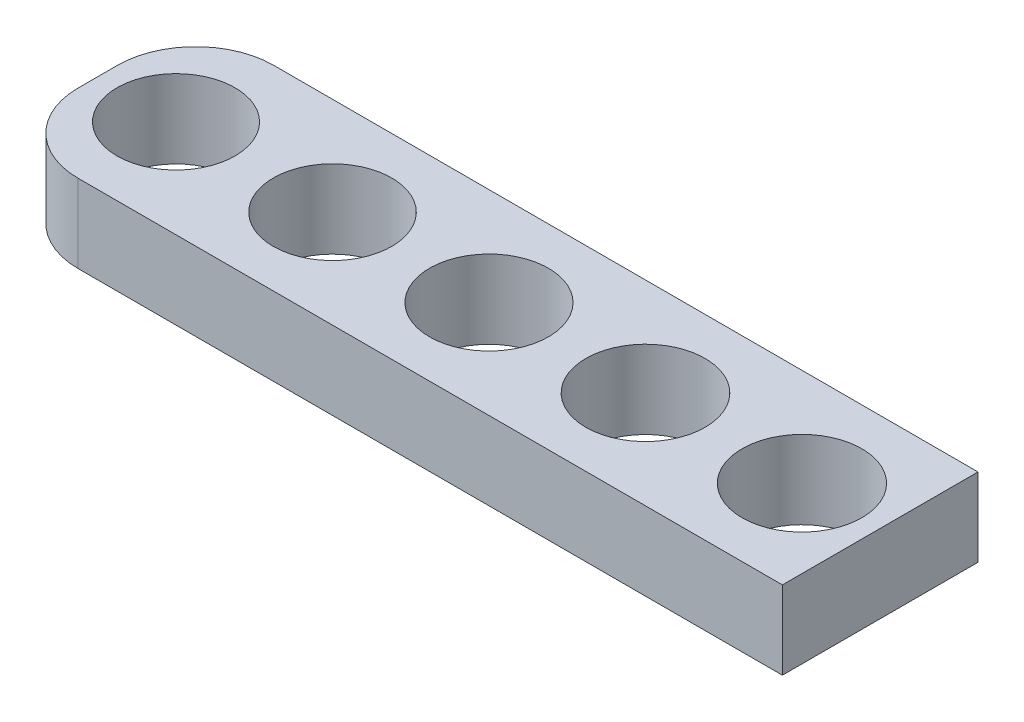
ISO-10303-21;
HEADER;
FILE_DESCRIPTION(('STEP AP214'),'2;1');
FILE_NAME('part.step','',(''),(''),'','','');
FILE_SCHEMA(('AUTOMOTIVE_DESIGN { 1 0 10303 214 1 1 1 1 }'));
ENDSEC;
DATA;
#1=APPLICATION_CONTEXT('core data for automotive mechanical design processes');
#2=APPLICATION_PROTOCOL_DEFINITION('international standard','automotive_design',2000,#1);
#3=PRODUCT_CONTEXT('',#1,'mechanical');
#4=PRODUCT('Part','Part','',(#3));
#5=PRODUCT_RELATED_PRODUCT_CATEGORY('part','',(#4));
#6=PRODUCT_DEFINITION_FORMATION('','',#4);
#7=PRODUCT_DEFINITION_CONTEXT('part definition',#1,'design');
#8=PRODUCT_DEFINITION('design','',#6,#7);
#9=PRODUCT_DEFINITION_SHAPE('','',#8);
#10=(LENGTH_UNIT() NAMED_UNIT(*) SI_UNIT(.MILLI.,.METRE.));
#11=(NAMED_UNIT(*) PLANE_ANGLE_UNIT() SI_UNIT($,.RADIAN.));
#12=(NAMED_UNIT(*) SI_UNIT($,.STERADIAN.) SOLID_ANGLE_UNIT());
#13=UNCERTAINTY_MEASURE_WITH_UNIT(LENGTH_MEASURE(1.E-05),#10,'distance_accuracy_value','');
#14=(GEOMETRIC_REPRESENTATION_CONTEXT(3) GLOBAL_UNCERTAINTY_ASSIGNED_CONTEXT((#13)) GLOBAL_UNIT_ASSIGNED_CONTEXT((#10,
#11,#12)) REPRESENTATION_CONTEXT('',''));
#15=CARTESIAN_POINT('',(0.,0.,0.));
#16=DIRECTION('',(0.,0.,1.));
#17=DIRECTION('',(1.,0.,0.));
#18=AXIS2_PLACEMENT_3D('',#15,#16,#17);
#19=CARTESIAN_POINT('',(-40.,10.,2.5));
#20=DIRECTION('',(0.,1.,0.));
#21=DIRECTION('',(0.,0.,1.));
#22=AXIS2_PLACEMENT_3D('',#19,#20,#21);
#23=PLANE('',#22);
#24=CARTESIAN_POINT('',(20.,10.,0.));
#25=DIRECTION('',(0.,1.,0.));
#26=DIRECTION('',(0.,0.,1.));
#27=AXIS2_PLACEMENT_3D('',#24,#25,#26);
#28=CIRCLE('',#27,7.625);
#29=CARTESIAN_POINT('',(20.,10.,7.625));
#30=VERTEX_POINT('',#29);
#31=EDGE_CURVE('E216',#30,#30,#28,.T.);
#32=ORIENTED_EDGE('',*,*,#31,.F.);
#33=EDGE_LOOP('',(#32));
#34=FACE_BOUND('',#33,.T.);
#35=CARTESIAN_POINT('',(-20.,10.,0.));
#36=DIRECTION('',(0.,1.,0.));
#37=DIRECTION('',(0.,0.,1.));
#38=AXIS2_PLACEMENT_3D('',#35,#36,#37);
#39=CIRCLE('',#38,7.575);
#40=CARTESIAN_POINT('',(-20.,10.,7.575));
#41=VERTEX_POINT('',#40);
#42=EDGE_CURVE('E232',#41,#41,#39,.T.);
#43=ORIENTED_EDGE('',*,*,#42,.F.);
#44=EDGE_LOOP('',(#43));
#45=FACE_BOUND('',#44,.T.);
#46=DIRECTION('',(0.,0.,-1.));
#47=VECTOR('',#46,1.);
#48=CARTESIAN_POINT('',(50.,10.,-12.5));
#49=LINE('',#48,#47);
#50=CARTESIAN_POINT('',(50.,10.,12.5));
#51=VERTEX_POINT('',#50);
#52=CARTESIAN_POINT('',(50.,10.,-12.5));
#53=VERTEX_POINT('',#52);
#54=EDGE_CURVE('E146',#51,#53,#49,.T.);
#55=ORIENTED_EDGE('',*,*,#54,.T.);
#56=DIRECTION('',(-1.,0.,0.));
#57=VECTOR('',#56,1.);
#58=CARTESIAN_POINT('',(-39.9999999999999,10.,-12.5));
#59=LINE('',#58,#57);
#60=CARTESIAN_POINT('',(-39.9999999999999,10.,-12.5));
#61=VERTEX_POINT('',#60);
#62=EDGE_CURVE('E94',#53,#61,#59,.T.);
#63=ORIENTED_EDGE('',*,*,#62,.T.);
#64=CARTESIAN_POINT('',(-40.,10.,-2.5));
#65=DIRECTION('',(0.,1.,0.));
#66=DIRECTION('',(0.,0.,1.));
#67=AXIS2_PLACEMENT_3D('',#64,#65,#66);
#68=CIRCLE('',#67,9.99999999999999);
#69=CARTESIAN_POINT('',(-50.,10.,-2.49999999999993));
#70=VERTEX_POINT('',#69);
#71=EDGE_CURVE('E107',#61,#70,#68,.T.);
#72=ORIENTED_EDGE('',*,*,#71,.T.);
#73=DIRECTION('',(0.,0.,1.));
#74=VECTOR('',#73,1.);
#75=CARTESIAN_POINT('',(-50.,10.,-2.49999999999993));
#76=LINE('',#75,#74);
#77=CARTESIAN_POINT('',(-50.,10.,2.49999999999993));
#78=VERTEX_POINT('',#77);
#79=EDGE_CURVE('E101',#70,#78,#76,.T.);
#80=ORIENTED_EDGE('',*,*,#79,.T.);
#81=CARTESIAN_POINT('',(-40.,10.,2.5));
#82=DIRECTION('',(0.,1.,0.));
#83=DIRECTION('',(0.,0.,1.));
#84=AXIS2_PLACEMENT_3D('',#81,#82,#83);
#85=CIRCLE('',#84,10.);
#86=CARTESIAN_POINT('',(-39.9999999999999,10.,12.5));
#87=VERTEX_POINT('',#86);
#88=EDGE_CURVE('E105',#78,#87,#85,.T.);
#89=ORIENTED_EDGE('',*,*,#88,.T.);
#90=DIRECTION('',(1.,0.,0.));
#91=VECTOR('',#90,1.);
#92=CARTESIAN_POINT('',(-39.9999999999999,10.,12.5));
#93=LINE('',#92,#91);
#94=EDGE_CURVE('E57',#87,#51,#93,.T.);
#95=ORIENTED_EDGE('',*,*,#94,.T.);
#96=EDGE_LOOP('',(#55,#63,#72,#80,#89,#95));
#97=FACE_BOUND('',#96,.T.);
#98=CARTESIAN_POINT('',(-40.,10.,0.));
#99=DIRECTION('',(0.,1.,0.));
#100=DIRECTION('',(0.,0.,1.));
#101=AXIS2_PLACEMENT_3D('',#98,#99,#100);
#102=CIRCLE('',#101,7.55);
#103=CARTESIAN_POINT('',(-40.,10.,7.55));
#104=VERTEX_POINT('',#103);
#105=EDGE_CURVE('E134',#104,#104,#102,.T.);
#106=ORIENTED_EDGE('',*,*,#105,.F.);
#107=EDGE_LOOP('',(#106));
#108=FACE_BOUND('',#107,.T.);
#109=CARTESIAN_POINT('',(0.,10.,0.));
#110=DIRECTION('',(0.,1.,0.));
#111=DIRECTION('',(0.,0.,1.));
#112=AXIS2_PLACEMENT_3D('',#109,#110,#111);
#113=CIRCLE('',#112,7.6);
#114=CARTESIAN_POINT('',(0.,10.,7.6));
#115=VERTEX_POINT('',#114);
#116=EDGE_CURVE('E224',#115,#115,#113,.T.);
#117=ORIENTED_EDGE('',*,*,#116,.F.);
#118=EDGE_LOOP('',(#117));
#119=FACE_BOUND('',#118,.T.);
#120=CARTESIAN_POINT('',(40.,10.,0.));
#121=DIRECTION('',(0.,1.,0.));
#122=DIRECTION('',(0.,0.,1.));
#123=AXIS2_PLACEMENT_3D('',#120,#121,#122);
#124=CIRCLE('',#123,7.65);
#125=CARTESIAN_POINT('',(40.,10.,7.65));
#126=VERTEX_POINT('',#125);
#127=EDGE_CURVE('E205',#126,#126,#124,.T.);
#128=ORIENTED_EDGE('',*,*,#127,.F.);
#129=EDGE_LOOP('',(#128));
#130=FACE_BOUND('',#129,.T.);
#131=ADVANCED_FACE('F39',(#34,#45,#97,#108,#119,#130),#23,.T.);
#132=CARTESIAN_POINT('',(-40.,0.,2.5));
#133=DIRECTION('',(0.,1.,0.));
#134=DIRECTION('',(0.,0.,1.));
#135=AXIS2_PLACEMENT_3D('',#132,#133,#134);
#136=PLANE('',#135);
#137=DIRECTION('',(0.,0.,-1.));
#138=VECTOR('',#137,1.);
#139=CARTESIAN_POINT('',(50.,0.,-12.5));
#140=LINE('',#139,#138);
#141=CARTESIAN_POINT('',(50.,0.,12.5));
#142=VERTEX_POINT('',#141);
#143=CARTESIAN_POINT('',(50.,0.,-12.5));
#144=VERTEX_POINT('',#143);
#145=EDGE_CURVE('E129',#142,#144,#140,.T.);
#146=ORIENTED_EDGE('',*,*,#145,.F.);
#147=DIRECTION('',(1.,0.,0.));
#148=VECTOR('',#147,1.);
#149=CARTESIAN_POINT('',(-39.9999999999999,0.,12.5));
#150=LINE('',#149,#148);
#151=CARTESIAN_POINT('',(-39.9999999999999,0.,12.5));
#152=VERTEX_POINT('',#151);
#153=EDGE_CURVE('E86',#152,#142,#150,.T.);
#154=ORIENTED_EDGE('',*,*,#153,.F.);
#155=CARTESIAN_POINT('',(-40.,0.,2.5));
#156=DIRECTION('',(0.,1.,0.));
#157=DIRECTION('',(0.,0.,1.));
#158=AXIS2_PLACEMENT_3D('',#155,#156,#157);
#159=CIRCLE('',#158,10.);
#160=CARTESIAN_POINT('',(-50.,0.,2.49999999999993));
#161=VERTEX_POINT('',#160);
#162=EDGE_CURVE('E80',#161,#152,#159,.T.);
#163=ORIENTED_EDGE('',*,*,#162,.F.);
#164=DIRECTION('',(0.,0.,1.));
#165=VECTOR('',#164,1.);
#166=CARTESIAN_POINT('',(-50.,0.,-2.49999999999993));
#167=LINE('',#166,#165);
#168=CARTESIAN_POINT('',(-50.,0.,-2.49999999999993));
#169=VERTEX_POINT('',#168);
#170=EDGE_CURVE('E116',#169,#161,#167,.T.);
#171=ORIENTED_EDGE('',*,*,#170,.F.);
#172=CARTESIAN_POINT('',(-40.,0.,-2.5));
#173=DIRECTION('',(0.,1.,0.));
#174=DIRECTION('',(0.,0.,1.));
#175=AXIS2_PLACEMENT_3D('',#172,#173,#174);
#176=CIRCLE('',#175,9.99999999999999);
#177=CARTESIAN_POINT('',(-39.9999999999999,0.,-12.5));
#178=VERTEX_POINT('',#177);
#179=EDGE_CURVE('E137',#178,#169,#176,.T.);
#180=ORIENTED_EDGE('',*,*,#179,.F.);
#181=DIRECTION('',(-1.,0.,0.));
#182=VECTOR('',#181,1.);
#183=CARTESIAN_POINT('',(-39.9999999999999,0.,-12.5));
#184=LINE('',#183,#182);
#185=EDGE_CURVE('E133',#144,#178,#184,.T.);
#186=ORIENTED_EDGE('',*,*,#185,.F.);
#187=EDGE_LOOP('',(#146,#154,#163,#171,#180,#186));
#188=FACE_BOUND('',#187,.T.);
#189=CARTESIAN_POINT('',(-40.,0.,0.));
#190=DIRECTION('',(0.,1.,0.));
#191=DIRECTION('',(0.,0.,1.));
#192=AXIS2_PLACEMENT_3D('',#189,#190,#191);
#193=CIRCLE('',#192,7.55);
#194=CARTESIAN_POINT('',(-40.,0.,7.55));
#195=VERTEX_POINT('',#194);
#196=EDGE_CURVE('E236',#195,#195,#193,.T.);
#197=ORIENTED_EDGE('',*,*,#196,.T.);
#198=EDGE_LOOP('',(#197));
#199=FACE_BOUND('',#198,.T.);
#200=CARTESIAN_POINT('',(-20.,0.,0.));
#201=DIRECTION('',(0.,1.,0.));
#202=DIRECTION('',(0.,0.,1.));
#203=AXIS2_PLACEMENT_3D('',#200,#201,#202);
#204=CIRCLE('',#203,7.575);
#205=CARTESIAN_POINT('',(-20.,0.,7.575));
#206=VERTEX_POINT('',#205);
#207=EDGE_CURVE('E228',#206,#206,#204,.T.);
#208=ORIENTED_EDGE('',*,*,#207,.T.);
#209=EDGE_LOOP('',(#208));
#210=FACE_BOUND('',#209,.T.);
#211=CARTESIAN_POINT('',(0.,0.,0.));
#212=DIRECTION('',(0.,1.,0.));
#213=DIRECTION('',(0.,0.,1.));
#214=AXIS2_PLACEMENT_3D('',#211,#212,#213);
#215=CIRCLE('',#214,7.6);
#216=CARTESIAN_POINT('',(0.,0.,7.6));
#217=VERTEX_POINT('',#216);
#218=EDGE_CURVE('E220',#217,#217,#215,.T.);
#219=ORIENTED_EDGE('',*,*,#218,.T.);
#220=EDGE_LOOP('',(#219));
#221=FACE_BOUND('',#220,.T.);
#222=CARTESIAN_POINT('',(20.,0.,0.));
#223=DIRECTION('',(0.,1.,0.));
#224=DIRECTION('',(0.,0.,1.));
#225=AXIS2_PLACEMENT_3D('',#222,#223,#224);
#226=CIRCLE('',#225,7.625);
#227=CARTESIAN_POINT('',(20.,0.,7.625));
#228=VERTEX_POINT('',#227);
#229=EDGE_CURVE('E213',#228,#228,#226,.T.);
#230=ORIENTED_EDGE('',*,*,#229,.T.);
#231=EDGE_LOOP('',(#230));
#232=FACE_BOUND('',#231,.T.);
#233=CARTESIAN_POINT('',(40.,0.,0.));
#234=DIRECTION('',(0.,1.,0.));
#235=DIRECTION('',(0.,0.,1.));
#236=AXIS2_PLACEMENT_3D('',#233,#234,#235);
#237=CIRCLE('',#236,7.65);
#238=CARTESIAN_POINT('',(40.,0.,7.65));
#239=VERTEX_POINT('',#238);
#240=EDGE_CURVE('E208',#239,#239,#237,.T.);
#241=ORIENTED_EDGE('',*,*,#240,.T.);
#242=EDGE_LOOP('',(#241));
#243=FACE_BOUND('',#242,.T.);
#244=ADVANCED_FACE('F159',(#188,#199,#210,#221,#232,#243),#136,.F.);
#245=CARTESIAN_POINT('',(50.,10.,-12.5));
#246=DIRECTION('',(-1.,0.,0.));
#247=DIRECTION('',(0.,0.,1.));
#248=AXIS2_PLACEMENT_3D('',#245,#246,#247);
#249=PLANE('',#248);
#250=ORIENTED_EDGE('',*,*,#145,.T.);
#251=DIRECTION('',(0.,-1.,0.));
#252=VECTOR('',#251,1.);
#253=CARTESIAN_POINT('',(50.,10.,-12.5));
#254=LINE('',#253,#252);
#255=EDGE_CURVE('E11',#53,#144,#254,.T.);
#256=ORIENTED_EDGE('',*,*,#255,.F.);
#257=ORIENTED_EDGE('',*,*,#54,.F.);
#258=DIRECTION('',(0.,-1.,0.));
#259=VECTOR('',#258,1.);
#260=CARTESIAN_POINT('',(50.,10.,12.5));
#261=LINE('',#260,#259);
#262=EDGE_CURVE('E125',#51,#142,#261,.T.);
#263=ORIENTED_EDGE('',*,*,#262,.T.);
#264=EDGE_LOOP('',(#250,#256,#257,#263));
#265=FACE_BOUND('',#264,.T.);
#266=ADVANCED_FACE('F41',(#265),#249,.F.);
#267=CARTESIAN_POINT('',(-39.9999999999999,10.,-12.5));
#268=DIRECTION('',(0.,0.,1.));
#269=DIRECTION('',(1.,0.,0.));
#270=AXIS2_PLACEMENT_3D('',#267,#268,#269);
#271=PLANE('',#270);
#272=ORIENTED_EDGE('',*,*,#185,.T.);
#273=DIRECTION('',(0.,-1.,0.));
#274=VECTOR('',#273,1.);
#275=CARTESIAN_POINT('',(-39.9999999999999,10.,-12.5));
#276=LINE('',#275,#274);
#277=EDGE_CURVE('E49',#61,#178,#276,.T.);
#278=ORIENTED_EDGE('',*,*,#277,.F.);
#279=ORIENTED_EDGE('',*,*,#62,.F.);
#280=ORIENTED_EDGE('',*,*,#255,.T.);
#281=EDGE_LOOP('',(#272,#278,#279,#280));
#282=FACE_BOUND('',#281,.T.);
#283=ADVANCED_FACE('F309',(#282),#271,.F.);
#284=CARTESIAN_POINT('',(-40.,10.,-2.5));
#285=DIRECTION('',(0.,-1.,0.));
#286=DIRECTION('',(0.,0.,-1.));
#287=AXIS2_PLACEMENT_3D('',#284,#285,#286);
#288=CYLINDRICAL_SURFACE('',#287,9.99999999999999);
#289=ORIENTED_EDGE('',*,*,#179,.T.);
#290=DIRECTION('',(0.,-1.,0.));
#291=VECTOR('',#290,1.);
#292=CARTESIAN_POINT('',(-50.,10.,-2.49999999999993));
#293=LINE('',#292,#291);
#294=EDGE_CURVE('E118',#70,#169,#293,.T.);
#295=ORIENTED_EDGE('',*,*,#294,.F.);
#296=ORIENTED_EDGE('',*,*,#71,.F.);
#297=ORIENTED_EDGE('',*,*,#277,.T.);
#298=EDGE_LOOP('',(#289,#295,#296,#297));
#299=FACE_BOUND('',#298,.T.);
#300=ADVANCED_FACE('F156',(#299),#288,.T.);
#301=CARTESIAN_POINT('',(-50.,10.,-2.49999999999993));
#302=DIRECTION('',(1.,0.,0.));
#303=DIRECTION('',(0.,0.,-1.));
#304=AXIS2_PLACEMENT_3D('',#301,#302,#303);
#305=PLANE('',#304);
#306=ORIENTED_EDGE('',*,*,#170,.T.);
#307=DIRECTION('',(0.,-1.,0.));
#308=VECTOR('',#307,1.);
#309=CARTESIAN_POINT('',(-50.,10.,2.49999999999993));
#310=LINE('',#309,#308);
#311=EDGE_CURVE('E113',#78,#161,#310,.T.);
#312=ORIENTED_EDGE('',*,*,#311,.F.);
#313=ORIENTED_EDGE('',*,*,#79,.F.);
#314=ORIENTED_EDGE('',*,*,#294,.T.);
#315=EDGE_LOOP('',(#306,#312,#313,#314));
#316=FACE_BOUND('',#315,.T.);
#317=ADVANCED_FACE('F114',(#316),#305,.F.);
#318=CARTESIAN_POINT('',(-40.,10.,2.5));
#319=DIRECTION('',(0.,-1.,0.));
#320=DIRECTION('',(0.,0.,-1.));
#321=AXIS2_PLACEMENT_3D('',#318,#319,#320);
#322=CYLINDRICAL_SURFACE('',#321,10.);
#323=ORIENTED_EDGE('',*,*,#162,.T.);
#324=DIRECTION('',(0.,-1.,0.));
#325=VECTOR('',#324,1.);
#326=CARTESIAN_POINT('',(-39.9999999999999,10.,12.5));
#327=LINE('',#326,#325);
#328=EDGE_CURVE('E119',#87,#152,#327,.T.);
#329=ORIENTED_EDGE('',*,*,#328,.F.);
#330=ORIENTED_EDGE('',*,*,#88,.F.);
#331=ORIENTED_EDGE('',*,*,#311,.T.);
#332=EDGE_LOOP('',(#323,#329,#330,#331));
#333=FACE_BOUND('',#332,.T.);
#334=ADVANCED_FACE('F121',(#333),#322,.T.);
#335=CARTESIAN_POINT('',(-39.9999999999999,10.,12.5));
#336=DIRECTION('',(0.,0.,-1.));
#337=DIRECTION('',(-1.,0.,0.));
#338=AXIS2_PLACEMENT_3D('',#335,#336,#337);
#339=PLANE('',#338);
#340=ORIENTED_EDGE('',*,*,#153,.T.);
#341=ORIENTED_EDGE('',*,*,#262,.F.);
#342=ORIENTED_EDGE('',*,*,#94,.F.);
#343=ORIENTED_EDGE('',*,*,#328,.T.);
#344=EDGE_LOOP('',(#340,#341,#342,#343));
#345=FACE_BOUND('',#344,.T.);
#346=ADVANCED_FACE('F164',(#345),#339,.F.);
#347=CARTESIAN_POINT('',(-40.,10.,0.));
#348=DIRECTION('',(0.,-1.,0.));
#349=DIRECTION('',(0.,0.,-1.));
#350=AXIS2_PLACEMENT_3D('',#347,#348,#349);
#351=CYLINDRICAL_SURFACE('',#350,7.55);
#352=ORIENTED_EDGE('',*,*,#105,.T.);
#353=EDGE_LOOP('',(#352));
#354=FACE_BOUND('',#353,.T.);
#355=ORIENTED_EDGE('',*,*,#196,.F.);
#356=EDGE_LOOP('',(#355));
#357=FACE_BOUND('',#356,.T.);
#358=ADVANCED_FACE('F166',(#354,#357),#351,.F.);
#359=CARTESIAN_POINT('',(-20.,10.,0.));
#360=DIRECTION('',(0.,-1.,0.));
#361=DIRECTION('',(0.,0.,-1.));
#362=AXIS2_PLACEMENT_3D('',#359,#360,#361);
#363=CYLINDRICAL_SURFACE('',#362,7.575);
#364=ORIENTED_EDGE('',*,*,#42,.T.);
#365=EDGE_LOOP('',(#364));
#366=FACE_BOUND('',#365,.T.);
#367=ORIENTED_EDGE('',*,*,#207,.F.);
#368=EDGE_LOOP('',(#367));
#369=FACE_BOUND('',#368,.T.);
#370=ADVANCED_FACE('F172',(#366,#369),#363,.F.);
#371=CARTESIAN_POINT('',(0.,10.,0.));
#372=DIRECTION('',(0.,-1.,0.));
#373=DIRECTION('',(0.,0.,-1.));
#374=AXIS2_PLACEMENT_3D('',#371,#372,#373);
#375=CYLINDRICAL_SURFACE('',#374,7.6);
#376=ORIENTED_EDGE('',*,*,#116,.T.);
#377=EDGE_LOOP('',(#376));
#378=FACE_BOUND('',#377,.T.);
#379=ORIENTED_EDGE('',*,*,#218,.F.);
#380=EDGE_LOOP('',(#379));
#381=FACE_BOUND('',#380,.T.);
#382=ADVANCED_FACE('F188',(#378,#381),#375,.F.);
#383=CARTESIAN_POINT('',(20.,10.,0.));
#384=DIRECTION('',(0.,-1.,0.));
#385=DIRECTION('',(0.,0.,-1.));
#386=AXIS2_PLACEMENT_3D('',#383,#384,#385);
#387=CYLINDRICAL_SURFACE('',#386,7.625);
#388=ORIENTED_EDGE('',*,*,#31,.T.);
#389=EDGE_LOOP('',(#388));
#390=FACE_BOUND('',#389,.T.);
#391=ORIENTED_EDGE('',*,*,#229,.F.);
#392=EDGE_LOOP('',(#391));
#393=FACE_BOUND('',#392,.T.);
#394=ADVANCED_FACE('F192',(#390,#393),#387,.F.);
#395=CARTESIAN_POINT('',(40.,10.,0.));
#396=DIRECTION('',(0.,-1.,0.));
#397=DIRECTION('',(0.,0.,-1.));
#398=AXIS2_PLACEMENT_3D('',#395,#396,#397);
#399=CYLINDRICAL_SURFACE('',#398,7.65);
#400=ORIENTED_EDGE('',*,*,#127,.T.);
#401=EDGE_LOOP('',(#400));
#402=FACE_BOUND('',#401,.T.);
#403=ORIENTED_EDGE('',*,*,#240,.F.);
#404=EDGE_LOOP('',(#403));
#405=FACE_BOUND('',#404,.T.);
#406=ADVANCED_FACE('F196',(#402,#405),#399,.F.);
#407=CLOSED_SHELL('',(#131,#244,#266,#283,#300,#317,#334,#346,#358,#370,#382,#394,#406));
#408=MANIFOLD_SOLID_BREP('B2',#407);
#409=ADVANCED_BREP_SHAPE_REPRESENTATION('',(#18,#408),#14);
#410=SHAPE_DEFINITION_REPRESENTATION(#9,#409);
ENDSEC;
END-ISO-10303-21;
